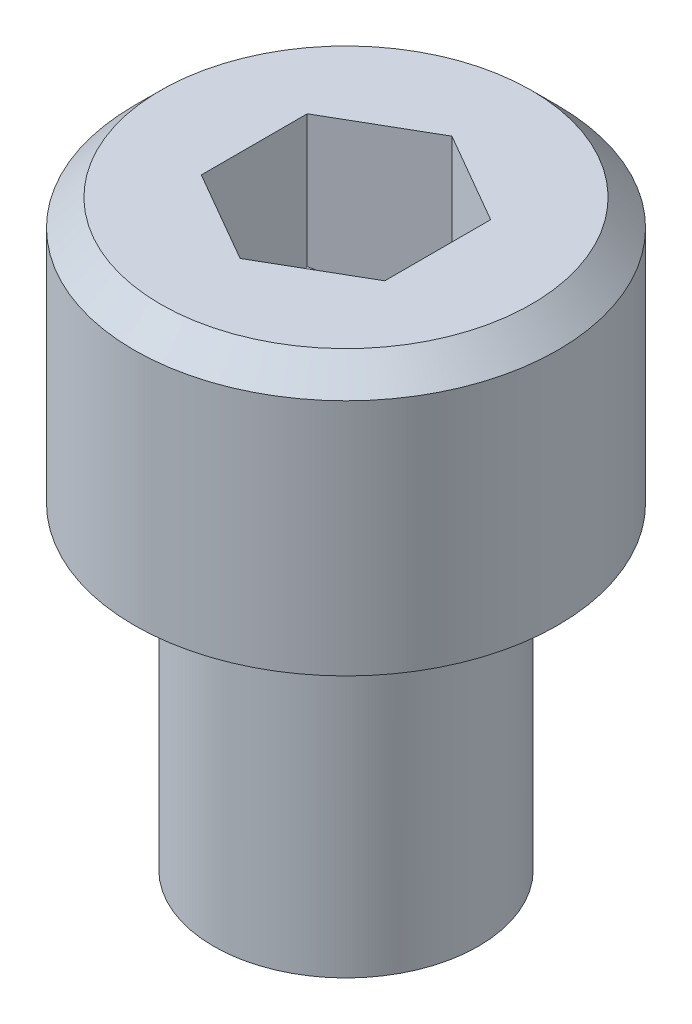
ISO-10303-21;
HEADER;
FILE_DESCRIPTION(('STEP AP214'),'2;1');
FILE_NAME('part.step','',(''),(''),'','','');
FILE_SCHEMA(('AUTOMOTIVE_DESIGN { 1 0 10303 214 1 1 1 1 }'));
ENDSEC;
DATA;
#1=APPLICATION_CONTEXT('core data for automotive mechanical design processes');
#2=APPLICATION_PROTOCOL_DEFINITION('international standard','automotive_design',2000,#1);
#3=PRODUCT_CONTEXT('',#1,'mechanical');
#4=PRODUCT('Part','Part','',(#3));
#5=PRODUCT_RELATED_PRODUCT_CATEGORY('part','',(#4));
#6=PRODUCT_DEFINITION_FORMATION('','',#4);
#7=PRODUCT_DEFINITION_CONTEXT('part definition',#1,'design');
#8=PRODUCT_DEFINITION('design','',#6,#7);
#9=PRODUCT_DEFINITION_SHAPE('','',#8);
#10=(LENGTH_UNIT() NAMED_UNIT(*) SI_UNIT(.MILLI.,.METRE.));
#11=(NAMED_UNIT(*) PLANE_ANGLE_UNIT() SI_UNIT($,.RADIAN.));
#12=(NAMED_UNIT(*) SI_UNIT($,.STERADIAN.) SOLID_ANGLE_UNIT());
#13=UNCERTAINTY_MEASURE_WITH_UNIT(LENGTH_MEASURE(1.E-05),#10,'distance_accuracy_value','');
#14=(GEOMETRIC_REPRESENTATION_CONTEXT(3) GLOBAL_UNCERTAINTY_ASSIGNED_CONTEXT((#13)) GLOBAL_UNIT_ASSIGNED_CONTEXT((#10,
#11,#12)) REPRESENTATION_CONTEXT('',''));
#15=CARTESIAN_POINT('',(0.,0.,0.));
#16=DIRECTION('',(0.,0.,1.));
#17=DIRECTION('',(1.,0.,0.));
#18=AXIS2_PLACEMENT_3D('',#15,#16,#17);
#19=CARTESIAN_POINT('',(0.,0.,0.));
#20=DIRECTION('',(0.,1.,0.));
#21=DIRECTION('',(0.,0.,1.));
#22=AXIS2_PLACEMENT_3D('',#19,#20,#21);
#23=PLANE('',#22);
#24=CARTESIAN_POINT('',(0.,0.,0.));
#25=DIRECTION('',(0.,1.,0.));
#26=DIRECTION('',(0.,0.,1.));
#27=AXIS2_PLACEMENT_3D('',#24,#25,#26);
#28=CIRCLE('',#27,8.);
#29=CARTESIAN_POINT('',(0.,0.,8.));
#30=VERTEX_POINT('',#29);
#31=EDGE_CURVE('E192',#30,#30,#28,.T.);
#32=ORIENTED_EDGE('',*,*,#31,.F.);
#33=EDGE_LOOP('',(#32));
#34=FACE_BOUND('',#33,.T.);
#35=CARTESIAN_POINT('',(0.,0.,0.));
#36=DIRECTION('',(0.,1.,0.));
#37=DIRECTION('',(0.,0.,1.));
#38=AXIS2_PLACEMENT_3D('',#35,#36,#37);
#39=CIRCLE('',#38,5.);
#40=CARTESIAN_POINT('',(0.,0.,5.));
#41=VERTEX_POINT('',#40);
#42=EDGE_CURVE('E11',#41,#41,#39,.F.);
#43=ORIENTED_EDGE('',*,*,#42,.F.);
#44=EDGE_LOOP('',(#43));
#45=FACE_BOUND('',#44,.T.);
#46=ADVANCED_FACE('F32',(#34,#45),#23,.F.);
#47=CARTESIAN_POINT('',(0.,10.,0.));
#48=DIRECTION('',(0.,1.,0.));
#49=DIRECTION('',(0.,0.,1.));
#50=AXIS2_PLACEMENT_3D('',#47,#48,#49);
#51=PLANE('',#50);
#52=CARTESIAN_POINT('',(0.,10.,0.));
#53=DIRECTION('',(0.,1.,0.));
#54=DIRECTION('',(0.,0.,1.));
#55=AXIS2_PLACEMENT_3D('',#52,#53,#54);
#56=CIRCLE('',#55,7.);
#57=CARTESIAN_POINT('',(0.,10.,7.));
#58=VERTEX_POINT('',#57);
#59=EDGE_CURVE('E105',#58,#58,#56,.T.);
#60=ORIENTED_EDGE('',*,*,#59,.T.);
#61=EDGE_LOOP('',(#60));
#62=FACE_BOUND('',#61,.T.);
#63=DIRECTION('',(-0.866025403784439,0.,0.5));
#64=VECTOR('',#63,1.);
#65=CARTESIAN_POINT('',(0.,10.,-4.));
#66=LINE('',#65,#64);
#67=CARTESIAN_POINT('',(0.,10.,-4.));
#68=VERTEX_POINT('',#67);
#69=CARTESIAN_POINT('',(-3.46410161513775,10.,-2.));
#70=VERTEX_POINT('',#69);
#71=EDGE_CURVE('E168',#68,#70,#66,.T.);
#72=ORIENTED_EDGE('',*,*,#71,.F.);
#73=DIRECTION('',(-0.866025403784439,0.,-0.5));
#74=VECTOR('',#73,1.);
#75=CARTESIAN_POINT('',(3.46410161513775,10.,-2.));
#76=LINE('',#75,#74);
#77=CARTESIAN_POINT('',(3.46410161513775,10.,-2.));
#78=VERTEX_POINT('',#77);
#79=EDGE_CURVE('E166',#78,#68,#76,.T.);
#80=ORIENTED_EDGE('',*,*,#79,.F.);
#81=DIRECTION('',(0.,0.,-1.));
#82=VECTOR('',#81,1.);
#83=CARTESIAN_POINT('',(3.46410161513775,10.,2.));
#84=LINE('',#83,#82);
#85=CARTESIAN_POINT('',(3.46410161513775,10.,2.));
#86=VERTEX_POINT('',#85);
#87=EDGE_CURVE('E177',#86,#78,#84,.T.);
#88=ORIENTED_EDGE('',*,*,#87,.F.);
#89=DIRECTION('',(0.866025403784439,0.,-0.5));
#90=VECTOR('',#89,1.);
#91=CARTESIAN_POINT('',(0.,10.,4.));
#92=LINE('',#91,#90);
#93=CARTESIAN_POINT('',(0.,10.,4.));
#94=VERTEX_POINT('',#93);
#95=EDGE_CURVE('E174',#94,#86,#92,.T.);
#96=ORIENTED_EDGE('',*,*,#95,.F.);
#97=DIRECTION('',(0.866025403784439,0.,0.5));
#98=VECTOR('',#97,1.);
#99=CARTESIAN_POINT('',(-3.46410161513775,10.,2.));
#100=LINE('',#99,#98);
#101=CARTESIAN_POINT('',(-3.46410161513775,10.,2.));
#102=VERTEX_POINT('',#101);
#103=EDGE_CURVE('E172',#102,#94,#100,.T.);
#104=ORIENTED_EDGE('',*,*,#103,.F.);
#105=DIRECTION('',(0.,0.,1.));
#106=VECTOR('',#105,1.);
#107=CARTESIAN_POINT('',(-3.46410161513775,10.,-2.));
#108=LINE('',#107,#106);
#109=EDGE_CURVE('E170',#70,#102,#108,.T.);
#110=ORIENTED_EDGE('',*,*,#109,.F.);
#111=EDGE_LOOP('',(#72,#80,#88,#96,#104,#110));
#112=FACE_BOUND('',#111,.T.);
#113=ADVANCED_FACE('F160',(#62,#112),#51,.T.);
#114=CARTESIAN_POINT('',(0.,10.,0.));
#115=DIRECTION('',(0.,-1.,0.));
#116=DIRECTION('',(0.,0.,-1.));
#117=AXIS2_PLACEMENT_3D('',#114,#115,#116);
#118=CYLINDRICAL_SURFACE('',#117,8.);
#119=CARTESIAN_POINT('',(0.,9.,0.));
#120=DIRECTION('',(0.,1.,0.));
#121=DIRECTION('',(0.,0.,1.));
#122=AXIS2_PLACEMENT_3D('',#119,#120,#121);
#123=CIRCLE('',#122,8.);
#124=CARTESIAN_POINT('',(0.,9.,8.));
#125=VERTEX_POINT('',#124);
#126=EDGE_CURVE('E103',#125,#125,#123,.F.);
#127=ORIENTED_EDGE('',*,*,#126,.T.);
#128=EDGE_LOOP('',(#127));
#129=FACE_BOUND('',#128,.T.);
#130=ORIENTED_EDGE('',*,*,#31,.T.);
#131=EDGE_LOOP('',(#130));
#132=FACE_BOUND('',#131,.T.);
#133=ADVANCED_FACE('F158',(#129,#132),#118,.T.);
#134=CARTESIAN_POINT('',(3.46410161513775,10.,-2.));
#135=DIRECTION('',(-0.5,0.,0.866025403784439));
#136=DIRECTION('',(0.866025403784439,0.,0.5));
#137=AXIS2_PLACEMENT_3D('',#134,#135,#136);
#138=PLANE('',#137);
#139=CARTESIAN_POINT('',(3.46430161513775,5.00006666955334,-1.99988452994616));
#140=CARTESIAN_POINT('',(3.31207195328988,4.94930438914995,-2.08777436619268));
#141=CARTESIAN_POINT('',(3.15852825461352,4.9031379155353,-2.17642286195584));
#142=CARTESIAN_POINT('',(2.8487820756984,4.8225538029865,-2.35525490173295));
#143=CARTESIAN_POINT('',(2.69257409162297,4.78816467186566,-2.44544162338847));
#144=CARTESIAN_POINT('',(2.38209403206612,4.73463288384245,-2.62469736935162));
#145=CARTESIAN_POINT('',(2.22786972828342,4.715133946207,-2.71373881265615));
#146=CARTESIAN_POINT('',(1.91869542629964,4.69185609735442,-2.892240679133));
#147=CARTESIAN_POINT('',(1.76374655189656,4.68805791024968,-2.98170045348025));
#148=CARTESIAN_POINT('',(1.47421484145074,4.69595859906126,-3.14886166444507));
#149=CARTESIAN_POINT('',(1.33958866811163,4.70571758763572,-3.22658812186238));
#150=CARTESIAN_POINT('',(1.07121341188381,4.73664811939852,-3.38153464828935));
#151=CARTESIAN_POINT('',(0.93746525728358,4.75783022896075,-3.4587541813514));
#152=CARTESIAN_POINT('',(0.668536642363201,4.81078396897833,-3.61402018956848));
#153=CARTESIAN_POINT('',(0.53339022003137,4.84278007329153,-3.69204701288177));
#154=CARTESIAN_POINT('',(0.265113077438774,4.91539868808409,-3.84693689337503));
#155=CARTESIAN_POINT('',(0.131978920028511,4.95600413517973,-3.92380193499418));
#156=CARTESIAN_POINT('',(-0.000200000000000142,5.00006666955333,-4.00011547005384));
#157=B_SPLINE_CURVE_WITH_KNOTS('',3,(#139,#140,#141,#142,#143,#144,#145,#146,#147,#148,#149,
#150,#151,#152,#153,#154,#155,#156),.UNSPECIFIED.,.F.,.F.,(4,2,2,2,2,2,2,2,4),(0.,
0.549103651497664,1.09952720178729,1.63632793223803,2.17246943374038,2.63930198432863,
3.10656709703108,3.58419706385537,4.06088909074922),.UNSPECIFIED.);
#158=CARTESIAN_POINT('',(3.46410161513775,5.,-2.));
#159=VERTEX_POINT('',#158);
#160=CARTESIAN_POINT('',(0.,5.,-4.));
#161=VERTEX_POINT('',#160);
#162=EDGE_CURVE('E98',#159,#161,#157,.T.);
#163=ORIENTED_EDGE('',*,*,#162,.F.);
#164=DIRECTION('',(0.,-1.,0.));
#165=VECTOR('',#164,1.);
#166=CARTESIAN_POINT('',(3.46410161513775,10.,-2.));
#167=LINE('',#166,#165);
#168=EDGE_CURVE('E179',#78,#159,#167,.T.);
#169=ORIENTED_EDGE('',*,*,#168,.F.);
#170=ORIENTED_EDGE('',*,*,#79,.T.);
#171=DIRECTION('',(0.,-1.,0.));
#172=VECTOR('',#171,1.);
#173=CARTESIAN_POINT('',(0.,10.,-4.));
#174=LINE('',#173,#172);
#175=EDGE_CURVE('E190',#68,#161,#174,.T.);
#176=ORIENTED_EDGE('',*,*,#175,.T.);
#177=EDGE_LOOP('',(#163,#169,#170,#176));
#178=FACE_BOUND('',#177,.T.);
#179=ADVANCED_FACE('F154',(#178),#138,.T.);
#180=CARTESIAN_POINT('',(0.,10.,-4.));
#181=DIRECTION('',(0.5,0.,0.866025403784439));
#182=DIRECTION('',(0.866025403784439,0.,-0.5));
#183=AXIS2_PLACEMENT_3D('',#180,#181,#182);
#184=PLANE('',#183);
#185=CARTESIAN_POINT('',(0.000199999999999763,5.00006666955333,-4.00011547005384));
#186=CARTESIAN_POINT('',(-0.152029661847872,4.94930438914995,-3.91222563380732));
#187=CARTESIAN_POINT('',(-0.305573360524233,4.9031379155353,-3.82357713804416));
#188=CARTESIAN_POINT('',(-0.615319539439356,4.8225538029865,-3.64474509826705));
#189=CARTESIAN_POINT('',(-0.771527523514785,4.78816467186566,-3.55455837661153));
#190=CARTESIAN_POINT('',(-1.08200758307163,4.73463288384245,-3.37530263064838));
#191=CARTESIAN_POINT('',(-1.23623188685433,4.715133946207,-3.28626118734385));
#192=CARTESIAN_POINT('',(-1.54540618883811,4.69185609735441,-3.107759320867));
#193=CARTESIAN_POINT('',(-1.7003550632412,4.68805791024968,-3.01829954651975));
#194=CARTESIAN_POINT('',(-1.98988677368701,4.69595859906126,-2.85113833555493));
#195=CARTESIAN_POINT('',(-2.12451294702612,4.70571758763572,-2.77341187813762));
#196=CARTESIAN_POINT('',(-2.39288820325395,4.73664811939852,-2.61846535171066));
#197=CARTESIAN_POINT('',(-2.52663635785417,4.75783022896075,-2.5412458186486));
#198=CARTESIAN_POINT('',(-2.79556497277455,4.81078396897833,-2.38597981043152));
#199=CARTESIAN_POINT('',(-2.93071139510639,4.84278007329153,-2.30795298711823));
#200=CARTESIAN_POINT('',(-3.19898853769898,4.91539868808409,-2.15306310662497));
#201=CARTESIAN_POINT('',(-3.33212269510924,4.95600413517974,-2.07619806500582));
#202=CARTESIAN_POINT('',(-3.46430161513775,5.00006666955333,-1.99988452994616));
#203=B_SPLINE_CURVE_WITH_KNOTS('',3,(#185,#186,#187,#188,#189,#190,#191,#192,#193,#194,#195,
#196,#197,#198,#199,#200,#201,#202),.UNSPECIFIED.,.F.,.F.,(4,2,2,2,2,2,2,2,4),(0.,
0.549103651497663,1.09952720178729,1.63632793223803,2.17246943374038,2.63930198432863,
3.10656709703107,3.58419706385537,4.06088909074922),.UNSPECIFIED.);
#204=CARTESIAN_POINT('',(-3.46410161513775,5.,-2.));
#205=VERTEX_POINT('',#204);
#206=EDGE_CURVE('E47',#161,#205,#203,.T.);
#207=ORIENTED_EDGE('',*,*,#206,.F.);
#208=ORIENTED_EDGE('',*,*,#175,.F.);
#209=ORIENTED_EDGE('',*,*,#71,.T.);
#210=DIRECTION('',(0.,-1.,0.));
#211=VECTOR('',#210,1.);
#212=CARTESIAN_POINT('',(-3.46410161513775,10.,-2.));
#213=LINE('',#212,#211);
#214=EDGE_CURVE('E188',#70,#205,#213,.T.);
#215=ORIENTED_EDGE('',*,*,#214,.T.);
#216=EDGE_LOOP('',(#207,#208,#209,#215));
#217=FACE_BOUND('',#216,.T.);
#218=ADVANCED_FACE('F150',(#217),#184,.T.);
#219=CARTESIAN_POINT('',(-3.46410161513775,10.,-2.));
#220=DIRECTION('',(1.,0.,0.));
#221=DIRECTION('',(0.,0.,-1.));
#222=AXIS2_PLACEMENT_3D('',#219,#220,#221);
#223=PLANE('',#222);
#224=CARTESIAN_POINT('',(-3.46410161513775,6.2880752251816,-5.1793346318868));
#225=CARTESIAN_POINT('',(-3.46410161513775,6.21630672088335,-5.02974279176783));
#226=CARTESIAN_POINT('',(-3.46410161513775,6.1452836616502,-4.8797865254893));
#227=CARTESIAN_POINT('',(-3.46410161513775,6.00515131415526,-4.57895091615085));
#228=CARTESIAN_POINT('',(-3.46410161513775,5.93604237024099,-4.42807141288604));
#229=CARTESIAN_POINT('',(-3.46410161513775,5.7997750507546,-4.12432999569553));
#230=CARTESIAN_POINT('',(-3.46410161513775,5.73263105038897,-3.97146160827715));
#231=CARTESIAN_POINT('',(-3.46410161513775,5.60135395249503,-3.66444205719959));
#232=CARTESIAN_POINT('',(-3.46410161513775,5.53722069850965,-3.51029096068913));
#233=CARTESIAN_POINT('',(-3.46410161513775,5.41113372668479,-3.19640016988702));
#234=CARTESIAN_POINT('',(-3.46410161513775,5.34928083567558,-3.03661973511468));
#235=CARTESIAN_POINT('',(-3.46410161513775,5.23071756056974,-2.7151262146137));
#236=CARTESIAN_POINT('',(-3.46410161513775,5.1740077724744,-2.55341290734813));
#237=CARTESIAN_POINT('',(-3.46410161513775,5.06735005956277,-2.22816270773479));
#238=CARTESIAN_POINT('',(-3.46410161513775,5.01738678280669,-2.06463090449417));
#239=CARTESIAN_POINT('',(-3.46410161513775,4.92593790398363,-1.73523803197434));
#240=CARTESIAN_POINT('',(-3.46410161513775,4.88444945259711,-1.56937776565717));
#241=CARTESIAN_POINT('',(-3.46410161513775,4.81215459054741,-1.23565203167523));
#242=CARTESIAN_POINT('',(-3.46410161513775,4.78132670237446,-1.06779130887689));
#243=CARTESIAN_POINT('',(-3.46410161513775,4.73237415738482,-0.730191861655885));
#244=CARTESIAN_POINT('',(-3.46410161513775,4.71424864211895,-0.560453264931017));
#245=CARTESIAN_POINT('',(-3.46410161513775,4.69238253598964,-0.222071635047859));
#246=CARTESIAN_POINT('',(-3.46410161513775,4.68847219331105,-0.0534398426334187));
#247=CARTESIAN_POINT('',(-3.46410161513775,4.69493151813067,0.283560150774781));
#248=CARTESIAN_POINT('',(-3.46410161513775,4.70530206984704,0.45192833480071));
#249=CARTESIAN_POINT('',(-3.46410161513775,4.73492603471225,0.743475997778274));
#250=CARTESIAN_POINT('',(-3.46410161513775,4.75115371223188,0.866977761216813));
#251=CARTESIAN_POINT('',(-3.46410161513775,4.79017640700282,1.11294687804726));
#252=CARTESIAN_POINT('',(-3.46410161513775,4.8129724789131,1.23541406206814));
#253=CARTESIAN_POINT('',(-3.46410161513775,4.89000057236258,1.6011689163223));
#254=CARTESIAN_POINT('',(-3.46410161513775,4.95285468408862,1.84265405895895));
#255=CARTESIAN_POINT('',(-3.46410161513775,5.06022810081814,2.2037177192393));
#256=CARTESIAN_POINT('',(-3.46410161513775,5.09869678221692,2.32519988020662));
#257=CARTESIAN_POINT('',(-3.46410161513775,5.17921599341474,2.56698279139653));
#258=CARTESIAN_POINT('',(-3.46410161513775,5.22126654892588,2.68728353313151));
#259=CARTESIAN_POINT('',(-3.46410161513775,5.3083094070664,2.92675169198162));
#260=CARTESIAN_POINT('',(-3.46410161513775,5.3533005205512,3.04591954517088));
#261=CARTESIAN_POINT('',(-3.46410161513775,5.44573678719095,3.28329472556748));
#262=CARTESIAN_POINT('',(-3.46410161513775,5.49318189986912,3.40150206858049));
#263=CARTESIAN_POINT('',(-3.46410161513775,5.61733214326281,3.70324108025));
#264=CARTESIAN_POINT('',(-3.46410161513775,5.69550291778392,3.8861689330422));
#265=CARTESIAN_POINT('',(-3.46410161513775,5.85560505336865,4.25037657696392));
#266=CARTESIAN_POINT('',(-3.46410161513775,5.93753669519475,4.43165624383607));
#267=CARTESIAN_POINT('',(-3.46410161513775,6.10431195159989,4.79292002029663));
#268=CARTESIAN_POINT('',(-3.46410161513775,6.18915625771003,4.97290380977186));
#269=CARTESIAN_POINT('',(-3.46410161513775,6.36111082006072,5.33178739994039));
#270=CARTESIAN_POINT('',(-3.46410161513775,6.44822112669974,5.51068717641471));
#271=CARTESIAN_POINT('',(-3.46410161513775,6.71242489473608,6.04648959158658));
#272=CARTESIAN_POINT('',(-3.46410161513775,6.89219292557963,6.40207214817661));
#273=CARTESIAN_POINT('',(-3.46410161513775,7.25632341018232,7.11079655322456));
#274=CARTESIAN_POINT('',(-3.46410161513775,7.44068520072347,7.46393874471082));
#275=CARTESIAN_POINT('',(-3.46410161513775,7.79504851408266,8.13528630435526));
#276=CARTESIAN_POINT('',(-3.46410161513775,7.96476313354901,8.45364335483344));
#277=CARTESIAN_POINT('',(-3.46410161513775,8.30612551639196,9.08933522303256));
#278=CARTESIAN_POINT('',(-3.46410161513775,8.4777733617523,9.40666999666157));
#279=CARTESIAN_POINT('',(-3.46410161513775,8.82207977744903,10.0397443730977));
#280=CARTESIAN_POINT('',(-3.46410161513775,8.99473466648163,10.3554859802581));
#281=CARTESIAN_POINT('',(-3.46410161513775,9.34116724635636,10.9863291340078));
#282=CARTESIAN_POINT('',(-3.46410161513775,9.51494487179813,11.3014307164986));
#283=CARTESIAN_POINT('',(-3.46410161513775,9.68913436241518,11.6163029781472));
#284=B_SPLINE_CURVE_WITH_KNOTS('',3,(#224,#225,#226,#227,#228,#229,#230,#231,#232,#233,#234,
#235,#236,#237,#238,#239,#240,#241,#242,#243,#244,#245,#246,#247,#248,#249,#250,#251,#252,#253,
#254,#255,#256,#257,#258,#259,#260,#261,#262,#263,#264,#265,#266,#267,#268,#269,#270,#271,#272,
#273,#274,#275,#276,#277,#278,#279,#280,#281,#282,#283),.UNSPECIFIED.,.F.,.F.,(4,2,2,2,2,2,2,2,
2,2,2,2,2,2,2,2,2,2,2,2,2,2,2,2,2,2,2,2,2,4),(0.,0.497757948324446,0.995604868741851,
1.49647174671909,1.99731256766701,2.5112482217199,3.02524335659129,3.5380484229456,
4.05068079439344,4.56227428050541,5.07383318887535,5.57926282205854,6.08472375091081,
6.45822909821063,6.83179445111722,7.57939360307526,7.9616490055982,8.34390715233141,
8.72601166126049,9.10810986968843,9.70483976823961,10.3016142875386,10.898531487803,
11.4954619755625,12.6907246064345,13.8858156614243,14.9681136010853,16.050457612685,
17.1300486434693,18.2095773441616),.UNSPECIFIED.);
#285=CARTESIAN_POINT('',(-3.46410161513775,5.,2.));
#286=VERTEX_POINT('',#285);
#287=EDGE_CURVE('E55',#205,#286,#284,.T.);
#288=ORIENTED_EDGE('',*,*,#287,.F.);
#289=ORIENTED_EDGE('',*,*,#214,.F.);
#290=ORIENTED_EDGE('',*,*,#109,.T.);
#291=DIRECTION('',(0.,-1.,0.));
#292=VECTOR('',#291,1.);
#293=CARTESIAN_POINT('',(-3.46410161513775,10.,2.));
#294=LINE('',#293,#292);
#295=EDGE_CURVE('E186',#102,#286,#294,.T.);
#296=ORIENTED_EDGE('',*,*,#295,.T.);
#297=EDGE_LOOP('',(#288,#289,#290,#296));
#298=FACE_BOUND('',#297,.T.);
#299=ADVANCED_FACE('F147',(#298),#223,.T.);
#300=CARTESIAN_POINT('',(-3.46410161513775,10.,2.));
#301=DIRECTION('',(0.5,0.,-0.866025403784439));
#302=DIRECTION('',(-0.866025403784439,0.,-0.5));
#303=AXIS2_PLACEMENT_3D('',#300,#301,#302);
#304=PLANE('',#303);
#305=CARTESIAN_POINT('',(-3.46430161513775,5.00006666955333,1.99988452994616));
#306=CARTESIAN_POINT('',(-3.31207195328988,4.94930438914995,2.08777436619268));
#307=CARTESIAN_POINT('',(-3.15852825461352,4.9031379155353,2.17642286195584));
#308=CARTESIAN_POINT('',(-2.8487820756984,4.8225538029865,2.35525490173295));
#309=CARTESIAN_POINT('',(-2.69257409162297,4.78816467186566,2.44544162338847));
#310=CARTESIAN_POINT('',(-2.38209403206612,4.73463288384245,2.62469736935162));
#311=CARTESIAN_POINT('',(-2.22786972828342,4.715133946207,2.71373881265615));
#312=CARTESIAN_POINT('',(-1.91869542629964,4.69185609735441,2.892240679133));
#313=CARTESIAN_POINT('',(-1.76374655189656,4.68805791024968,2.98170045348025));
#314=CARTESIAN_POINT('',(-1.47421484145074,4.69595859906126,3.14886166444507));
#315=CARTESIAN_POINT('',(-1.33958866811163,4.70571758763572,3.22658812186238));
#316=CARTESIAN_POINT('',(-1.07121341188381,4.73664811939852,3.38153464828935));
#317=CARTESIAN_POINT('',(-0.93746525728358,4.75783022896075,3.4587541813514));
#318=CARTESIAN_POINT('',(-0.668536642363201,4.81078396897833,3.61402018956848));
#319=CARTESIAN_POINT('',(-0.53339022003137,4.84278007329153,3.69204701288177));
#320=CARTESIAN_POINT('',(-0.265113077438774,4.91539868808409,3.84693689337503));
#321=CARTESIAN_POINT('',(-0.13197892002851,4.95600413517973,3.92380193499418));
#322=CARTESIAN_POINT('',(0.000200000000000191,5.00006666955333,4.00011547005384));
#323=B_SPLINE_CURVE_WITH_KNOTS('',3,(#305,#306,#307,#308,#309,#310,#311,#312,#313,#314,#315,
#316,#317,#318,#319,#320,#321,#322),.UNSPECIFIED.,.F.,.F.,(4,2,2,2,2,2,2,2,4),(0.,
0.549103651497663,1.09952720178729,1.63632793223803,2.17246943374038,2.63930198432863,
3.10656709703107,3.58419706385537,4.06088909074922),.UNSPECIFIED.);
#324=CARTESIAN_POINT('',(0.,5.,4.));
#325=VERTEX_POINT('',#324);
#326=EDGE_CURVE('E132',#286,#325,#323,.T.);
#327=ORIENTED_EDGE('',*,*,#326,.F.);
#328=ORIENTED_EDGE('',*,*,#295,.F.);
#329=ORIENTED_EDGE('',*,*,#103,.T.);
#330=DIRECTION('',(0.,-1.,0.));
#331=VECTOR('',#330,1.);
#332=CARTESIAN_POINT('',(0.,10.,4.));
#333=LINE('',#332,#331);
#334=EDGE_CURVE('E183',#94,#325,#333,.T.);
#335=ORIENTED_EDGE('',*,*,#334,.T.);
#336=EDGE_LOOP('',(#327,#328,#329,#335));
#337=FACE_BOUND('',#336,.T.);
#338=ADVANCED_FACE('F122',(#337),#304,.T.);
#339=CARTESIAN_POINT('',(0.,10.,4.));
#340=DIRECTION('',(-0.5,0.,-0.866025403784439));
#341=DIRECTION('',(-0.866025403784439,0.,0.5));
#342=AXIS2_PLACEMENT_3D('',#339,#340,#341);
#343=PLANE('',#342);
#344=CARTESIAN_POINT('',(-0.000200000000000116,5.00006666955333,4.00011547005384));
#345=CARTESIAN_POINT('',(0.152029661847872,4.94930438914995,3.91222563380732));
#346=CARTESIAN_POINT('',(0.305573360524232,4.9031379155353,3.82357713804416));
#347=CARTESIAN_POINT('',(0.615319539439356,4.8225538029865,3.64474509826705));
#348=CARTESIAN_POINT('',(0.771527523514784,4.78816467186566,3.55455837661153));
#349=CARTESIAN_POINT('',(1.08200758307163,4.73463288384245,3.37530263064838));
#350=CARTESIAN_POINT('',(1.23623188685433,4.715133946207,3.28626118734385));
#351=CARTESIAN_POINT('',(1.54540618883811,4.69185609735442,3.107759320867));
#352=CARTESIAN_POINT('',(1.7003550632412,4.68805791024968,3.01829954651975));
#353=CARTESIAN_POINT('',(1.98988677368701,4.69595859906126,2.85113833555493));
#354=CARTESIAN_POINT('',(2.12451294702612,4.70571758763572,2.77341187813762));
#355=CARTESIAN_POINT('',(2.39288820325395,4.73664811939852,2.61846535171066));
#356=CARTESIAN_POINT('',(2.52663635785417,4.75783022896075,2.5412458186486));
#357=CARTESIAN_POINT('',(2.79556497277455,4.81078396897833,2.38597981043152));
#358=CARTESIAN_POINT('',(2.93071139510638,4.84278007329153,2.30795298711823));
#359=CARTESIAN_POINT('',(3.19898853769898,4.91539868808409,2.15306310662497));
#360=CARTESIAN_POINT('',(3.33212269510924,4.95600413517974,2.07619806500582));
#361=CARTESIAN_POINT('',(3.46430161513775,5.00006666955334,1.99988452994616));
#362=B_SPLINE_CURVE_WITH_KNOTS('',3,(#344,#345,#346,#347,#348,#349,#350,#351,#352,#353,#354,
#355,#356,#357,#358,#359,#360,#361),.UNSPECIFIED.,.F.,.F.,(4,2,2,2,2,2,2,2,4),(0.,
0.549103651497663,1.09952720178729,1.63632793223803,2.17246943374038,2.63930198432863,
3.10656709703107,3.58419706385537,4.06088909074922),.UNSPECIFIED.);
#363=CARTESIAN_POINT('',(3.46410161513775,5.,2.));
#364=VERTEX_POINT('',#363);
#365=EDGE_CURVE('E100',#325,#364,#362,.T.);
#366=ORIENTED_EDGE('',*,*,#365,.F.);
#367=ORIENTED_EDGE('',*,*,#334,.F.);
#368=ORIENTED_EDGE('',*,*,#95,.T.);
#369=DIRECTION('',(0.,-1.,0.));
#370=VECTOR('',#369,1.);
#371=CARTESIAN_POINT('',(3.46410161513775,10.,2.));
#372=LINE('',#371,#370);
#373=EDGE_CURVE('E181',#86,#364,#372,.T.);
#374=ORIENTED_EDGE('',*,*,#373,.T.);
#375=EDGE_LOOP('',(#366,#367,#368,#374));
#376=FACE_BOUND('',#375,.T.);
#377=ADVANCED_FACE('F118',(#376),#343,.T.);
#378=CARTESIAN_POINT('',(3.46410161513775,10.,2.));
#379=DIRECTION('',(-1.,0.,0.));
#380=DIRECTION('',(0.,0.,1.));
#381=AXIS2_PLACEMENT_3D('',#378,#379,#380);
#382=PLANE('',#381);
#383=CARTESIAN_POINT('',(3.46410161513775,6.2880752242876,-5.17933463002393));
#384=CARTESIAN_POINT('',(3.46410161513775,6.21630672002787,-5.02974278996863));
#385=CARTESIAN_POINT('',(3.46410161513775,6.14528366083321,-4.87978652375381));
#386=CARTESIAN_POINT('',(3.46410161513775,6.00515131341503,-4.57895091454302));
#387=CARTESIAN_POINT('',(3.46410161513775,5.93604236953904,-4.42807141134215));
#388=CARTESIAN_POINT('',(3.46410161513775,5.79977505012924,-4.12432999428075));
#389=CARTESIAN_POINT('',(3.46410161513775,5.73263104980193,-3.97146160692754));
#390=CARTESIAN_POINT('',(3.46410161513775,5.60135395198387,-3.66444205598082));
#391=CARTESIAN_POINT('',(3.46410161513775,5.53722069803606,-3.51029095953603));
#392=CARTESIAN_POINT('',(3.46410161513775,5.41113372628658,-3.1964001688691));
#393=CARTESIAN_POINT('',(3.46410161513775,5.34928083531511,-3.0366197341663));
#394=CARTESIAN_POINT('',(3.46410161513775,5.23071756028245,-2.71512621380562));
#395=CARTESIAN_POINT('',(3.46410161513775,5.17400777222255,-2.55341290661082));
#396=CARTESIAN_POINT('',(3.46410161513775,5.06735005937788,-2.22816270714035));
#397=CARTESIAN_POINT('',(3.46410161513775,5.01738678265336,-2.06463090397183));
#398=CARTESIAN_POINT('',(3.46410161513775,4.92593790388752,-1.73523803159823));
#399=CARTESIAN_POINT('',(3.46410161513775,4.88444945252667,-1.56937776535518));
#400=CARTESIAN_POINT('',(3.46410161513775,4.81215459052411,-1.23565203154453));
#401=CARTESIAN_POINT('',(3.46410161513775,4.78132670237131,-1.06779130884364));
#402=CARTESIAN_POINT('',(3.46410161513775,4.73237415740688,-0.730191861819574));
#403=CARTESIAN_POINT('',(3.46410161513775,4.71424864214607,-0.560453265194194));
#404=CARTESIAN_POINT('',(3.46410161513775,4.69238253600941,-0.222071635508164));
#405=CARTESIAN_POINT('',(3.46410161513775,4.6884721933187,-0.0534398431913514));
#406=CARTESIAN_POINT('',(3.46410161513775,4.69493151809793,0.283560150023418));
#407=CARTESIAN_POINT('',(3.46410161513775,4.705302069786,0.451928333953546));
#408=CARTESIAN_POINT('',(3.46410161513775,4.73492603459492,0.743475996806205));
#409=CARTESIAN_POINT('',(3.46410161513775,4.75115371209169,0.866977760214612));
#410=CARTESIAN_POINT('',(3.46410161513775,4.79017640681565,1.112946876986));
#411=CARTESIAN_POINT('',(3.46410161513775,4.8129724787018,1.23541406097794));
#412=CARTESIAN_POINT('',(3.46410161513775,4.89000057207829,1.60116891514667));
#413=CARTESIAN_POINT('',(3.46410161513775,4.95285468375491,1.84265405772828));
#414=CARTESIAN_POINT('',(3.46410161513775,5.06022810041116,2.20371771792615));
#415=CARTESIAN_POINT('',(3.46410161513775,5.0986967817853,2.32519987886544));
#416=CARTESIAN_POINT('',(3.46410161513775,5.17921599293447,2.56698278999953));
#417=CARTESIAN_POINT('',(3.46410161513775,5.22126654842159,2.68728353170672));
#418=CARTESIAN_POINT('',(3.46410161513775,5.30830940651478,2.9267516905014));
#419=CARTESIAN_POINT('',(3.46410161513775,5.35330051997626,3.04591954366303));
#420=CARTESIAN_POINT('',(3.46410161513775,5.44573678657004,3.28329472400436));
#421=CARTESIAN_POINT('',(3.46410161513775,5.49318189922556,3.40150206698973));
#422=CARTESIAN_POINT('',(3.46410161513775,5.61733214258359,3.7032410786409));
#423=CARTESIAN_POINT('',(3.46410161513775,5.69550291709357,3.88616893144178));
#424=CARTESIAN_POINT('',(3.46410161513775,5.85560505265913,4.25037657537978));
#425=CARTESIAN_POINT('',(3.46410161513775,5.93753669447718,4.43165624225954));
#426=CARTESIAN_POINT('',(3.46410161513775,6.10431195086851,4.79292001873449));
#427=CARTESIAN_POINT('',(3.46410161513775,6.18915625697287,4.97290380821653));
#428=CARTESIAN_POINT('',(3.46410161513775,6.36111081931367,5.33178739839798));
#429=CARTESIAN_POINT('',(3.46410161513775,6.44822112594856,5.51068717487841));
#430=CARTESIAN_POINT('',(3.46410161513775,6.71242489397459,6.0464895900684));
#431=CARTESIAN_POINT('',(3.46410161513775,6.89219292481378,6.40207214666961));
#432=CARTESIAN_POINT('',(3.46410161513775,7.25632340941048,7.11079655173853));
#433=CARTESIAN_POINT('',(3.46410161513775,7.44068519994998,7.46393874323457));
#434=CARTESIAN_POINT('',(3.46410161513775,7.79504851330295,8.1352863028879));
#435=CARTESIAN_POINT('',(3.46410161513775,7.96476313276449,8.45364335336531));
#436=CARTESIAN_POINT('',(3.46410161513775,8.30612551559869,9.0893352215625));
#437=CARTESIAN_POINT('',(3.46410161513775,8.47777336095508,9.40666999519033));
#438=CARTESIAN_POINT('',(3.46410161513775,8.82207977664391,10.0397443716228));
#439=CARTESIAN_POINT('',(3.46410161513775,8.99473466567254,10.3554859787806));
#440=CARTESIAN_POINT('',(3.46410161513775,9.34116724553976,10.9863291325249));
#441=CARTESIAN_POINT('',(3.46410161513775,9.51494487097796,11.3014307150129));
#442=CARTESIAN_POINT('',(3.46410161513775,9.68913436159159,11.6163029766586));
#443=B_SPLINE_CURVE_WITH_KNOTS('',3,(#383,#384,#385,#386,#387,#388,#389,#390,#391,#392,#393,
#394,#395,#396,#397,#398,#399,#400,#401,#402,#403,#404,#405,#406,#407,#408,#409,#410,#411,#412,
#413,#414,#415,#416,#417,#418,#419,#420,#421,#422,#423,#424,#425,#426,#427,#428,#429,#430,#431,
#432,#433,#434,#435,#436,#437,#438,#439,#440,#441,#442),.UNSPECIFIED.,.F.,.F.,(4,2,2,2,2,2,2,2,
2,2,2,2,2,2,2,2,2,2,2,2,2,2,2,2,2,2,2,2,2,4),(0.,0.497757948102269,0.995604868297457,
1.49647174604947,1.99731256677219,2.5112482205897,3.02524335522562,3.53804842134557,
4.05068079255928,4.56227427837348,5.07383318644606,5.57926281933836,6.08472374789949,
6.45822909510078,6.8317944479088,7.57939359966948,7.96164900208991,8.34390714872061,
8.72601165754741,9.10810986587306,9.70483976443495,10.3016142837448,10.8985314840202,
11.4954619717908,12.6907246026868,13.8858156577002,14.9681135973524,16.0504576089434,
17.1300486397153,18.209577340395),.UNSPECIFIED.);
#444=EDGE_CURVE('E40',#364,#159,#443,.F.);
#445=ORIENTED_EDGE('',*,*,#444,.F.);
#446=ORIENTED_EDGE('',*,*,#373,.F.);
#447=ORIENTED_EDGE('',*,*,#87,.T.);
#448=ORIENTED_EDGE('',*,*,#168,.T.);
#449=EDGE_LOOP('',(#445,#446,#447,#448));
#450=FACE_BOUND('',#449,.T.);
#451=ADVANCED_FACE('F114',(#450),#382,.T.);
#452=CARTESIAN_POINT('',(0.,10.,0.));
#453=DIRECTION('',(0.,-1.,0.));
#454=DIRECTION('',(0.,0.,-1.));
#455=AXIS2_PLACEMENT_3D('',#452,#453,#454);
#456=CONICAL_SURFACE('',#455,7.,0.785398163397447);
#457=ORIENTED_EDGE('',*,*,#126,.F.);
#458=EDGE_LOOP('',(#457));
#459=FACE_BOUND('',#458,.T.);
#460=ORIENTED_EDGE('',*,*,#59,.F.);
#461=EDGE_LOOP('',(#460));
#462=FACE_BOUND('',#461,.T.);
#463=ADVANCED_FACE('F34',(#459,#462),#456,.T.);
#464=CARTESIAN_POINT('',(0.,5.,0.));
#465=DIRECTION('',(0.,1.,0.));
#466=DIRECTION('',(-1.,0.,0.));
#467=AXIS2_PLACEMENT_3D('',#464,#465,#466);
#468=CONICAL_SURFACE('',#467,4.,1.0471975511966);
#469=CARTESIAN_POINT('',(0.,2.69059892324151,0.));
#470=VERTEX_POINT('',#469);
#471=VERTEX_LOOP('',#470);
#472=FACE_BOUND('',#471,.T.);
#473=ORIENTED_EDGE('',*,*,#444,.T.);
#474=ORIENTED_EDGE('',*,*,#162,.T.);
#475=ORIENTED_EDGE('',*,*,#206,.T.);
#476=ORIENTED_EDGE('',*,*,#287,.T.);
#477=ORIENTED_EDGE('',*,*,#326,.T.);
#478=ORIENTED_EDGE('',*,*,#365,.T.);
#479=EDGE_LOOP('',(#473,#474,#475,#476,#477,#478));
#480=FACE_BOUND('',#479,.T.);
#481=ADVANCED_FACE('F89',(#472,#480),#468,.F.);
#482=CARTESIAN_POINT('',(0.,-12.,0.));
#483=DIRECTION('',(0.,1.,0.));
#484=DIRECTION('',(0.,0.,1.));
#485=AXIS2_PLACEMENT_3D('',#482,#483,#484);
#486=CYLINDRICAL_SURFACE('',#485,5.);
#487=CARTESIAN_POINT('',(0.,-12.,0.));
#488=DIRECTION('',(0.,-1.,0.));
#489=DIRECTION('',(0.,0.,-1.));
#490=AXIS2_PLACEMENT_3D('',#487,#488,#489);
#491=CIRCLE('',#490,5.);
#492=CARTESIAN_POINT('',(0.,-12.,-5.));
#493=VERTEX_POINT('',#492);
#494=EDGE_CURVE('E133',#493,#493,#491,.T.);
#495=ORIENTED_EDGE('',*,*,#494,.F.);
#496=EDGE_LOOP('',(#495));
#497=FACE_BOUND('',#496,.T.);
#498=ORIENTED_EDGE('',*,*,#42,.T.);
#499=EDGE_LOOP('',(#498));
#500=FACE_BOUND('',#499,.T.);
#501=ADVANCED_FACE('F92',(#497,#500),#486,.T.);
#502=CARTESIAN_POINT('',(0.,-12.,0.));
#503=DIRECTION('',(0.,-1.,0.));
#504=DIRECTION('',(0.,0.,-1.));
#505=AXIS2_PLACEMENT_3D('',#502,#503,#504);
#506=PLANE('',#505);
#507=ORIENTED_EDGE('',*,*,#494,.T.);
#508=EDGE_LOOP('',(#507));
#509=FACE_BOUND('',#508,.T.);
#510=ADVANCED_FACE('F265',(#509),#506,.T.);
#511=CLOSED_SHELL('',(#46,#113,#133,#179,#218,#299,#338,#377,#451,#463,#481,#501,#510));
#512=MANIFOLD_SOLID_BREP('B2',#511);
#513=ADVANCED_BREP_SHAPE_REPRESENTATION('',(#18,#512),#14);
#514=SHAPE_DEFINITION_REPRESENTATION(#9,#513);
ENDSEC;
END-ISO-10303-21;
